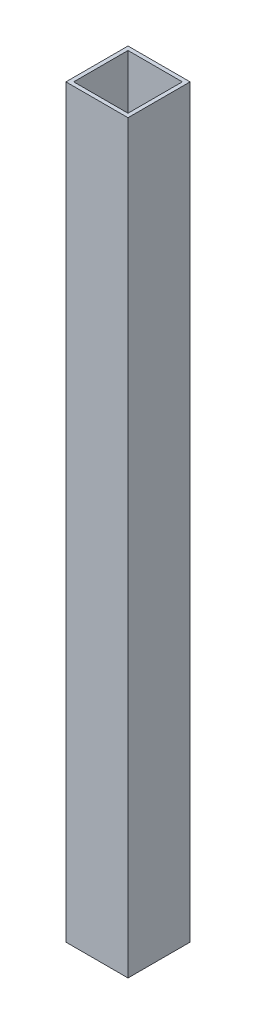
ISO-10303-21;
HEADER;
FILE_DESCRIPTION(('STEP AP214'),'2;1');
FILE_NAME('part.step','',(''),(''),'','','');
FILE_SCHEMA(('AUTOMOTIVE_DESIGN { 1 0 10303 214 1 1 1 1 }'));
ENDSEC;
DATA;
#1=APPLICATION_CONTEXT('core data for automotive mechanical design processes');
#2=APPLICATION_PROTOCOL_DEFINITION('international standard','automotive_design',2000,#1);
#3=PRODUCT_CONTEXT('',#1,'mechanical');
#4=PRODUCT('Part','Part','',(#3));
#5=PRODUCT_RELATED_PRODUCT_CATEGORY('part','',(#4));
#6=PRODUCT_DEFINITION_FORMATION('','',#4);
#7=PRODUCT_DEFINITION_CONTEXT('part definition',#1,'design');
#8=PRODUCT_DEFINITION('design','',#6,#7);
#9=PRODUCT_DEFINITION_SHAPE('','',#8);
#10=(LENGTH_UNIT() NAMED_UNIT(*) SI_UNIT(.MILLI.,.METRE.));
#11=(NAMED_UNIT(*) PLANE_ANGLE_UNIT() SI_UNIT($,.RADIAN.));
#12=(NAMED_UNIT(*) SI_UNIT($,.STERADIAN.) SOLID_ANGLE_UNIT());
#13=UNCERTAINTY_MEASURE_WITH_UNIT(LENGTH_MEASURE(1.E-05),#10,'distance_accuracy_value','');
#14=(GEOMETRIC_REPRESENTATION_CONTEXT(3) GLOBAL_UNCERTAINTY_ASSIGNED_CONTEXT((#13)) GLOBAL_UNIT_ASSIGNED_CONTEXT((#10,
#11,#12)) REPRESENTATION_CONTEXT('',''));
#15=CARTESIAN_POINT('',(0.,0.,0.));
#16=DIRECTION('',(0.,0.,1.));
#17=DIRECTION('',(1.,0.,0.));
#18=AXIS2_PLACEMENT_3D('',#15,#16,#17);
#19=CARTESIAN_POINT('',(0.,609.6,0.));
#20=DIRECTION('',(0.,-1.,0.));
#21=DIRECTION('',(0.,0.,-1.));
#22=AXIS2_PLACEMENT_3D('',#19,#20,#21);
#23=PLANE('',#22);
#24=DIRECTION('',(0.,0.,-1.));
#25=VECTOR('',#24,1.);
#26=CARTESIAN_POINT('',(25.4,609.6,25.4));
#27=LINE('',#26,#25);
#28=CARTESIAN_POINT('',(25.4,609.6,25.4));
#29=VERTEX_POINT('',#28);
#30=CARTESIAN_POINT('',(25.4,609.6,-25.4));
#31=VERTEX_POINT('',#30);
#32=EDGE_CURVE('E159',#29,#31,#27,.T.);
#33=ORIENTED_EDGE('',*,*,#32,.T.);
#34=DIRECTION('',(-1.,0.,0.));
#35=VECTOR('',#34,1.);
#36=CARTESIAN_POINT('',(-25.4,609.6,-25.4));
#37=LINE('',#36,#35);
#38=CARTESIAN_POINT('',(-25.4,609.6,-25.4));
#39=VERTEX_POINT('',#38);
#40=EDGE_CURVE('E163',#31,#39,#37,.T.);
#41=ORIENTED_EDGE('',*,*,#40,.T.);
#42=DIRECTION('',(0.,0.,1.));
#43=VECTOR('',#42,1.);
#44=CARTESIAN_POINT('',(-25.4,609.6,25.4));
#45=LINE('',#44,#43);
#46=CARTESIAN_POINT('',(-25.4,609.6,25.4));
#47=VERTEX_POINT('',#46);
#48=EDGE_CURVE('E167',#39,#47,#45,.T.);
#49=ORIENTED_EDGE('',*,*,#48,.T.);
#50=DIRECTION('',(1.,0.,0.));
#51=VECTOR('',#50,1.);
#52=CARTESIAN_POINT('',(-25.4,609.6,25.4));
#53=LINE('',#52,#51);
#54=EDGE_CURVE('E170',#47,#29,#53,.T.);
#55=ORIENTED_EDGE('',*,*,#54,.T.);
#56=EDGE_LOOP('',(#33,#41,#49,#55));
#57=FACE_BOUND('',#56,.T.);
#58=DIRECTION('',(0.,0.,1.));
#59=VECTOR('',#58,1.);
#60=CARTESIAN_POINT('',(-22.225,609.6,22.225));
#61=LINE('',#60,#59);
#62=CARTESIAN_POINT('',(-22.225,609.6,-22.225));
#63=VERTEX_POINT('',#62);
#64=CARTESIAN_POINT('',(-22.225,609.6,22.225));
#65=VERTEX_POINT('',#64);
#66=EDGE_CURVE('E111',#63,#65,#61,.T.);
#67=ORIENTED_EDGE('',*,*,#66,.F.);
#68=DIRECTION('',(-1.,0.,0.));
#69=VECTOR('',#68,1.);
#70=CARTESIAN_POINT('',(-22.225,609.6,-22.225));
#71=LINE('',#70,#69);
#72=CARTESIAN_POINT('',(22.225,609.6,-22.225));
#73=VERTEX_POINT('',#72);
#74=EDGE_CURVE('E137',#73,#63,#71,.T.);
#75=ORIENTED_EDGE('',*,*,#74,.F.);
#76=DIRECTION('',(0.,0.,-1.));
#77=VECTOR('',#76,1.);
#78=CARTESIAN_POINT('',(22.225,609.6,22.225));
#79=LINE('',#78,#77);
#80=CARTESIAN_POINT('',(22.225,609.6,22.225));
#81=VERTEX_POINT('',#80);
#82=EDGE_CURVE('E133',#81,#73,#79,.T.);
#83=ORIENTED_EDGE('',*,*,#82,.F.);
#84=DIRECTION('',(1.,0.,0.));
#85=VECTOR('',#84,1.);
#86=CARTESIAN_POINT('',(-22.225,609.6,22.225));
#87=LINE('',#86,#85);
#88=EDGE_CURVE('E120',#65,#81,#87,.T.);
#89=ORIENTED_EDGE('',*,*,#88,.F.);
#90=EDGE_LOOP('',(#67,#75,#83,#89));
#91=FACE_BOUND('',#90,.T.);
#92=ADVANCED_FACE('F45',(#57,#91),#23,.F.);
#93=CARTESIAN_POINT('',(0.,0.,0.));
#94=DIRECTION('',(0.,-1.,0.));
#95=DIRECTION('',(0.,0.,-1.));
#96=AXIS2_PLACEMENT_3D('',#93,#94,#95);
#97=PLANE('',#96);
#98=DIRECTION('',(0.,0.,-1.));
#99=VECTOR('',#98,1.);
#100=CARTESIAN_POINT('',(25.4,0.,25.4));
#101=LINE('',#100,#99);
#102=CARTESIAN_POINT('',(25.4,0.,25.4));
#103=VERTEX_POINT('',#102);
#104=CARTESIAN_POINT('',(25.4,0.,-25.4));
#105=VERTEX_POINT('',#104);
#106=EDGE_CURVE('E129',#103,#105,#101,.T.);
#107=ORIENTED_EDGE('',*,*,#106,.F.);
#108=DIRECTION('',(1.,0.,0.));
#109=VECTOR('',#108,1.);
#110=CARTESIAN_POINT('',(-25.4,0.,25.4));
#111=LINE('',#110,#109);
#112=CARTESIAN_POINT('',(-25.4,0.,25.4));
#113=VERTEX_POINT('',#112);
#114=EDGE_CURVE('E164',#113,#103,#111,.T.);
#115=ORIENTED_EDGE('',*,*,#114,.F.);
#116=DIRECTION('',(0.,0.,1.));
#117=VECTOR('',#116,1.);
#118=CARTESIAN_POINT('',(-25.4,0.,25.4));
#119=LINE('',#118,#117);
#120=CARTESIAN_POINT('',(-25.4,0.,-25.4));
#121=VERTEX_POINT('',#120);
#122=EDGE_CURVE('E180',#121,#113,#119,.T.);
#123=ORIENTED_EDGE('',*,*,#122,.F.);
#124=DIRECTION('',(-1.,0.,0.));
#125=VECTOR('',#124,1.);
#126=CARTESIAN_POINT('',(-25.4,0.,-25.4));
#127=LINE('',#126,#125);
#128=EDGE_CURVE('E177',#105,#121,#127,.T.);
#129=ORIENTED_EDGE('',*,*,#128,.F.);
#130=EDGE_LOOP('',(#107,#115,#123,#129));
#131=FACE_BOUND('',#130,.T.);
#132=DIRECTION('',(-1.,0.,0.));
#133=VECTOR('',#132,1.);
#134=CARTESIAN_POINT('',(-22.225,0.,-22.225));
#135=LINE('',#134,#133);
#136=CARTESIAN_POINT('',(22.225,0.,-22.225));
#137=VERTEX_POINT('',#136);
#138=CARTESIAN_POINT('',(-22.225,0.,-22.225));
#139=VERTEX_POINT('',#138);
#140=EDGE_CURVE('E121',#137,#139,#135,.T.);
#141=ORIENTED_EDGE('',*,*,#140,.T.);
#142=DIRECTION('',(0.,0.,1.));
#143=VECTOR('',#142,1.);
#144=CARTESIAN_POINT('',(-22.225,0.,22.225));
#145=LINE('',#144,#143);
#146=CARTESIAN_POINT('',(-22.225,0.,22.225));
#147=VERTEX_POINT('',#146);
#148=EDGE_CURVE('E69',#139,#147,#145,.T.);
#149=ORIENTED_EDGE('',*,*,#148,.T.);
#150=DIRECTION('',(1.,0.,0.));
#151=VECTOR('',#150,1.);
#152=CARTESIAN_POINT('',(-22.225,0.,22.225));
#153=LINE('',#152,#151);
#154=CARTESIAN_POINT('',(22.225,0.,22.225));
#155=VERTEX_POINT('',#154);
#156=EDGE_CURVE('E127',#147,#155,#153,.T.);
#157=ORIENTED_EDGE('',*,*,#156,.T.);
#158=DIRECTION('',(0.,0.,-1.));
#159=VECTOR('',#158,1.);
#160=CARTESIAN_POINT('',(22.225,0.,22.225));
#161=LINE('',#160,#159);
#162=EDGE_CURVE('E146',#155,#137,#161,.T.);
#163=ORIENTED_EDGE('',*,*,#162,.T.);
#164=EDGE_LOOP('',(#141,#149,#157,#163));
#165=FACE_BOUND('',#164,.T.);
#166=ADVANCED_FACE('F203',(#131,#165),#97,.T.);
#167=CARTESIAN_POINT('',(25.4,609.6,25.4));
#168=DIRECTION('',(-1.,0.,0.));
#169=DIRECTION('',(0.,0.,1.));
#170=AXIS2_PLACEMENT_3D('',#167,#168,#169);
#171=PLANE('',#170);
#172=ORIENTED_EDGE('',*,*,#106,.T.);
#173=DIRECTION('',(0.,-1.,0.));
#174=VECTOR('',#173,1.);
#175=CARTESIAN_POINT('',(25.4,609.6,-25.4));
#176=LINE('',#175,#174);
#177=EDGE_CURVE('E11',#31,#105,#176,.T.);
#178=ORIENTED_EDGE('',*,*,#177,.F.);
#179=ORIENTED_EDGE('',*,*,#32,.F.);
#180=DIRECTION('',(0.,-1.,0.));
#181=VECTOR('',#180,1.);
#182=CARTESIAN_POINT('',(25.4,609.6,25.4));
#183=LINE('',#182,#181);
#184=EDGE_CURVE('E173',#29,#103,#183,.T.);
#185=ORIENTED_EDGE('',*,*,#184,.T.);
#186=EDGE_LOOP('',(#172,#178,#179,#185));
#187=FACE_BOUND('',#186,.T.);
#188=ADVANCED_FACE('F47',(#187),#171,.F.);
#189=CARTESIAN_POINT('',(-25.4,609.6,-25.4));
#190=DIRECTION('',(0.,0.,1.));
#191=DIRECTION('',(1.,0.,0.));
#192=AXIS2_PLACEMENT_3D('',#189,#190,#191);
#193=PLANE('',#192);
#194=ORIENTED_EDGE('',*,*,#128,.T.);
#195=DIRECTION('',(0.,-1.,0.));
#196=VECTOR('',#195,1.);
#197=CARTESIAN_POINT('',(-25.4,609.6,-25.4));
#198=LINE('',#197,#196);
#199=EDGE_CURVE('E54',#39,#121,#198,.T.);
#200=ORIENTED_EDGE('',*,*,#199,.F.);
#201=ORIENTED_EDGE('',*,*,#40,.F.);
#202=ORIENTED_EDGE('',*,*,#177,.T.);
#203=EDGE_LOOP('',(#194,#200,#201,#202));
#204=FACE_BOUND('',#203,.T.);
#205=ADVANCED_FACE('F213',(#204),#193,.F.);
#206=CARTESIAN_POINT('',(-25.4,609.6,25.4));
#207=DIRECTION('',(1.,0.,0.));
#208=DIRECTION('',(0.,0.,-1.));
#209=AXIS2_PLACEMENT_3D('',#206,#207,#208);
#210=PLANE('',#209);
#211=ORIENTED_EDGE('',*,*,#122,.T.);
#212=DIRECTION('',(0.,-1.,0.));
#213=VECTOR('',#212,1.);
#214=CARTESIAN_POINT('',(-25.4,609.6,25.4));
#215=LINE('',#214,#213);
#216=EDGE_CURVE('E188',#47,#113,#215,.T.);
#217=ORIENTED_EDGE('',*,*,#216,.F.);
#218=ORIENTED_EDGE('',*,*,#48,.F.);
#219=ORIENTED_EDGE('',*,*,#199,.T.);
#220=EDGE_LOOP('',(#211,#217,#218,#219));
#221=FACE_BOUND('',#220,.T.);
#222=ADVANCED_FACE('F197',(#221),#210,.F.);
#223=CARTESIAN_POINT('',(-25.4,609.6,25.4));
#224=DIRECTION('',(0.,0.,-1.));
#225=DIRECTION('',(-1.,0.,0.));
#226=AXIS2_PLACEMENT_3D('',#223,#224,#225);
#227=PLANE('',#226);
#228=ORIENTED_EDGE('',*,*,#114,.T.);
#229=ORIENTED_EDGE('',*,*,#184,.F.);
#230=ORIENTED_EDGE('',*,*,#54,.F.);
#231=ORIENTED_EDGE('',*,*,#216,.T.);
#232=EDGE_LOOP('',(#228,#229,#230,#231));
#233=FACE_BOUND('',#232,.T.);
#234=ADVANCED_FACE('F207',(#233),#227,.F.);
#235=CARTESIAN_POINT('',(-22.225,609.6,22.225));
#236=DIRECTION('',(1.,0.,0.));
#237=DIRECTION('',(0.,0.,-1.));
#238=AXIS2_PLACEMENT_3D('',#235,#236,#237);
#239=PLANE('',#238);
#240=ORIENTED_EDGE('',*,*,#148,.F.);
#241=DIRECTION('',(0.,-1.,0.));
#242=VECTOR('',#241,1.);
#243=CARTESIAN_POINT('',(-22.225,609.6,-22.225));
#244=LINE('',#243,#242);
#245=EDGE_CURVE('E115',#63,#139,#244,.T.);
#246=ORIENTED_EDGE('',*,*,#245,.F.);
#247=ORIENTED_EDGE('',*,*,#66,.T.);
#248=DIRECTION('',(0.,-1.,0.));
#249=VECTOR('',#248,1.);
#250=CARTESIAN_POINT('',(-22.225,609.6,22.225));
#251=LINE('',#250,#249);
#252=EDGE_CURVE('E114',#65,#147,#251,.T.);
#253=ORIENTED_EDGE('',*,*,#252,.T.);
#254=EDGE_LOOP('',(#240,#246,#247,#253));
#255=FACE_BOUND('',#254,.T.);
#256=ADVANCED_FACE('F113',(#255),#239,.T.);
#257=CARTESIAN_POINT('',(-22.225,609.6,22.225));
#258=DIRECTION('',(0.,0.,-1.));
#259=DIRECTION('',(-1.,0.,0.));
#260=AXIS2_PLACEMENT_3D('',#257,#258,#259);
#261=PLANE('',#260);
#262=ORIENTED_EDGE('',*,*,#156,.F.);
#263=ORIENTED_EDGE('',*,*,#252,.F.);
#264=ORIENTED_EDGE('',*,*,#88,.T.);
#265=DIRECTION('',(0.,-1.,0.));
#266=VECTOR('',#265,1.);
#267=CARTESIAN_POINT('',(22.225,609.6,22.225));
#268=LINE('',#267,#266);
#269=EDGE_CURVE('E130',#81,#155,#268,.T.);
#270=ORIENTED_EDGE('',*,*,#269,.T.);
#271=EDGE_LOOP('',(#262,#263,#264,#270));
#272=FACE_BOUND('',#271,.T.);
#273=ADVANCED_FACE('F124',(#272),#261,.T.);
#274=CARTESIAN_POINT('',(22.225,609.6,22.225));
#275=DIRECTION('',(-1.,0.,0.));
#276=DIRECTION('',(0.,0.,1.));
#277=AXIS2_PLACEMENT_3D('',#274,#275,#276);
#278=PLANE('',#277);
#279=ORIENTED_EDGE('',*,*,#162,.F.);
#280=ORIENTED_EDGE('',*,*,#269,.F.);
#281=ORIENTED_EDGE('',*,*,#82,.T.);
#282=DIRECTION('',(0.,-1.,0.));
#283=VECTOR('',#282,1.);
#284=CARTESIAN_POINT('',(22.225,609.6,-22.225));
#285=LINE('',#284,#283);
#286=EDGE_CURVE('E61',#73,#137,#285,.T.);
#287=ORIENTED_EDGE('',*,*,#286,.T.);
#288=EDGE_LOOP('',(#279,#280,#281,#287));
#289=FACE_BOUND('',#288,.T.);
#290=ADVANCED_FACE('F236',(#289),#278,.T.);
#291=CARTESIAN_POINT('',(-22.225,609.6,-22.225));
#292=DIRECTION('',(0.,0.,1.));
#293=DIRECTION('',(1.,0.,0.));
#294=AXIS2_PLACEMENT_3D('',#291,#292,#293);
#295=PLANE('',#294);
#296=ORIENTED_EDGE('',*,*,#140,.F.);
#297=ORIENTED_EDGE('',*,*,#286,.F.);
#298=ORIENTED_EDGE('',*,*,#74,.T.);
#299=ORIENTED_EDGE('',*,*,#245,.T.);
#300=EDGE_LOOP('',(#296,#297,#298,#299));
#301=FACE_BOUND('',#300,.T.);
#302=ADVANCED_FACE('F240',(#301),#295,.T.);
#303=CLOSED_SHELL('',(#92,#166,#188,#205,#222,#234,#256,#273,#290,#302));
#304=MANIFOLD_SOLID_BREP('B2',#303);
#305=ADVANCED_BREP_SHAPE_REPRESENTATION('',(#18,#304),#14);
#306=SHAPE_DEFINITION_REPRESENTATION(#9,#305);
ENDSEC;
END-ISO-10303-21;
